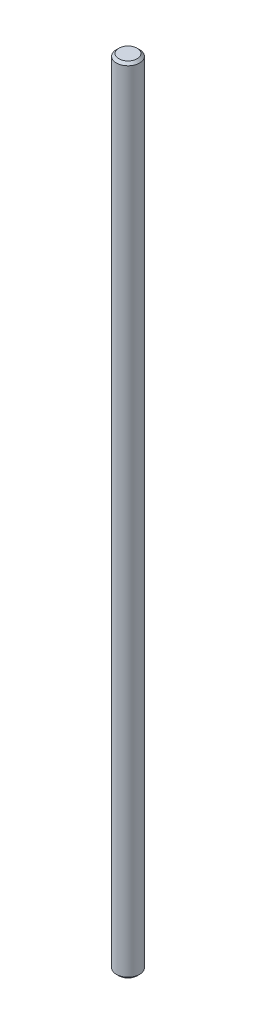
ISO-10303-21;
HEADER;
FILE_DESCRIPTION(('STEP AP214'),'2;1');
FILE_NAME('part.step','',(''),(''),'','','');
FILE_SCHEMA(('AUTOMOTIVE_DESIGN { 1 0 10303 214 1 1 1 1 }'));
ENDSEC;
DATA;
#1=APPLICATION_CONTEXT('core data for automotive mechanical design processes');
#2=APPLICATION_PROTOCOL_DEFINITION('international standard','automotive_design',2000,#1);
#3=PRODUCT_CONTEXT('',#1,'mechanical');
#4=PRODUCT('Part','Part','',(#3));
#5=PRODUCT_RELATED_PRODUCT_CATEGORY('part','',(#4));
#6=PRODUCT_DEFINITION_FORMATION('','',#4);
#7=PRODUCT_DEFINITION_CONTEXT('part definition',#1,'design');
#8=PRODUCT_DEFINITION('design','',#6,#7);
#9=PRODUCT_DEFINITION_SHAPE('','',#8);
#10=(LENGTH_UNIT() NAMED_UNIT(*) SI_UNIT(.MILLI.,.METRE.));
#11=(NAMED_UNIT(*) PLANE_ANGLE_UNIT() SI_UNIT($,.RADIAN.));
#12=(NAMED_UNIT(*) SI_UNIT($,.STERADIAN.) SOLID_ANGLE_UNIT());
#13=UNCERTAINTY_MEASURE_WITH_UNIT(LENGTH_MEASURE(1.E-05),#10,'distance_accuracy_value','');
#14=(GEOMETRIC_REPRESENTATION_CONTEXT(3) GLOBAL_UNCERTAINTY_ASSIGNED_CONTEXT((#13)) GLOBAL_UNIT_ASSIGNED_CONTEXT((#10,
#11,#12)) REPRESENTATION_CONTEXT('',''));
#15=CARTESIAN_POINT('',(0.,0.,0.));
#16=DIRECTION('',(0.,0.,1.));
#17=DIRECTION('',(1.,0.,0.));
#18=AXIS2_PLACEMENT_3D('',#15,#16,#17);
#19=CARTESIAN_POINT('',(0.,130.,0.));
#20=DIRECTION('',(0.,-1.,0.));
#21=DIRECTION('',(0.,0.,-1.));
#22=AXIS2_PLACEMENT_3D('',#19,#20,#21);
#23=CYLINDRICAL_SURFACE('',#22,1.9);
#24=CARTESIAN_POINT('',(0.,0.399999999999984,0.));
#25=DIRECTION('',(0.,1.,0.));
#26=DIRECTION('',(0.,0.,1.));
#27=AXIS2_PLACEMENT_3D('',#24,#25,#26);
#28=CIRCLE('',#27,1.9);
#29=CARTESIAN_POINT('',(0.,0.399999999999984,1.9));
#30=VERTEX_POINT('',#29);
#31=EDGE_CURVE('E46',#30,#30,#28,.T.);
#32=ORIENTED_EDGE('',*,*,#31,.T.);
#33=EDGE_LOOP('',(#32));
#34=FACE_BOUND('',#33,.T.);
#35=CARTESIAN_POINT('',(0.,129.6,0.));
#36=DIRECTION('',(0.,1.,0.));
#37=DIRECTION('',(0.,0.,1.));
#38=AXIS2_PLACEMENT_3D('',#35,#36,#37);
#39=CIRCLE('',#38,1.9);
#40=CARTESIAN_POINT('',(0.,129.6,1.9));
#41=VERTEX_POINT('',#40);
#42=EDGE_CURVE('E50',#41,#41,#39,.F.);
#43=ORIENTED_EDGE('',*,*,#42,.T.);
#44=EDGE_LOOP('',(#43));
#45=FACE_BOUND('',#44,.T.);
#46=ADVANCED_FACE('F34',(#34,#45),#23,.T.);
#47=CARTESIAN_POINT('',(0.,130.,0.));
#48=DIRECTION('',(0.,1.,0.));
#49=DIRECTION('',(0.,0.,1.));
#50=AXIS2_PLACEMENT_3D('',#47,#48,#49);
#51=PLANE('',#50);
#52=CARTESIAN_POINT('',(0.,130.,0.));
#53=DIRECTION('',(0.,1.,0.));
#54=DIRECTION('',(0.,0.,1.));
#55=AXIS2_PLACEMENT_3D('',#52,#53,#54);
#56=CIRCLE('',#55,1.5);
#57=CARTESIAN_POINT('',(0.,130.,1.5));
#58=VERTEX_POINT('',#57);
#59=EDGE_CURVE('E10',#58,#58,#56,.T.);
#60=ORIENTED_EDGE('',*,*,#59,.T.);
#61=EDGE_LOOP('',(#60));
#62=FACE_BOUND('',#61,.T.);
#63=ADVANCED_FACE('F66',(#62),#51,.T.);
#64=CARTESIAN_POINT('',(0.,0.,0.));
#65=DIRECTION('',(0.,1.,0.));
#66=DIRECTION('',(0.,0.,1.));
#67=AXIS2_PLACEMENT_3D('',#64,#65,#66);
#68=PLANE('',#67);
#69=CARTESIAN_POINT('',(0.,0.,0.));
#70=DIRECTION('',(0.,1.,0.));
#71=DIRECTION('',(0.,0.,1.));
#72=AXIS2_PLACEMENT_3D('',#69,#70,#71);
#73=CIRCLE('',#72,1.50000000000002);
#74=CARTESIAN_POINT('',(0.,0.,1.50000000000002));
#75=VERTEX_POINT('',#74);
#76=EDGE_CURVE('E42',#75,#75,#73,.F.);
#77=ORIENTED_EDGE('',*,*,#76,.T.);
#78=EDGE_LOOP('',(#77));
#79=FACE_BOUND('',#78,.T.);
#80=ADVANCED_FACE('F63',(#79),#68,.F.);
#81=CARTESIAN_POINT('',(0.,0.399999999999984,0.));
#82=DIRECTION('',(0.,1.,0.));
#83=DIRECTION('',(0.,0.,1.));
#84=AXIS2_PLACEMENT_3D('',#81,#82,#83);
#85=CONICAL_SURFACE('',#84,1.9,0.785398163397449);
#86=ORIENTED_EDGE('',*,*,#76,.F.);
#87=EDGE_LOOP('',(#86));
#88=FACE_BOUND('',#87,.T.);
#89=ORIENTED_EDGE('',*,*,#31,.F.);
#90=EDGE_LOOP('',(#89));
#91=FACE_BOUND('',#90,.T.);
#92=ADVANCED_FACE('F59',(#88,#91),#85,.T.);
#93=CARTESIAN_POINT('',(0.,130.,0.));
#94=DIRECTION('',(0.,-1.,0.));
#95=DIRECTION('',(0.,0.,-1.));
#96=AXIS2_PLACEMENT_3D('',#93,#94,#95);
#97=CONICAL_SURFACE('',#96,1.5,0.785398163397432);
#98=ORIENTED_EDGE('',*,*,#42,.F.);
#99=EDGE_LOOP('',(#98));
#100=FACE_BOUND('',#99,.T.);
#101=ORIENTED_EDGE('',*,*,#59,.F.);
#102=EDGE_LOOP('',(#101));
#103=FACE_BOUND('',#102,.T.);
#104=ADVANCED_FACE('F37',(#100,#103),#97,.T.);
#105=CLOSED_SHELL('',(#46,#63,#80,#92,#104));
#106=MANIFOLD_SOLID_BREP('B2',#105);
#107=ADVANCED_BREP_SHAPE_REPRESENTATION('',(#18,#106),#14);
#108=SHAPE_DEFINITION_REPRESENTATION(#9,#107);
ENDSEC;
END-ISO-10303-21;
